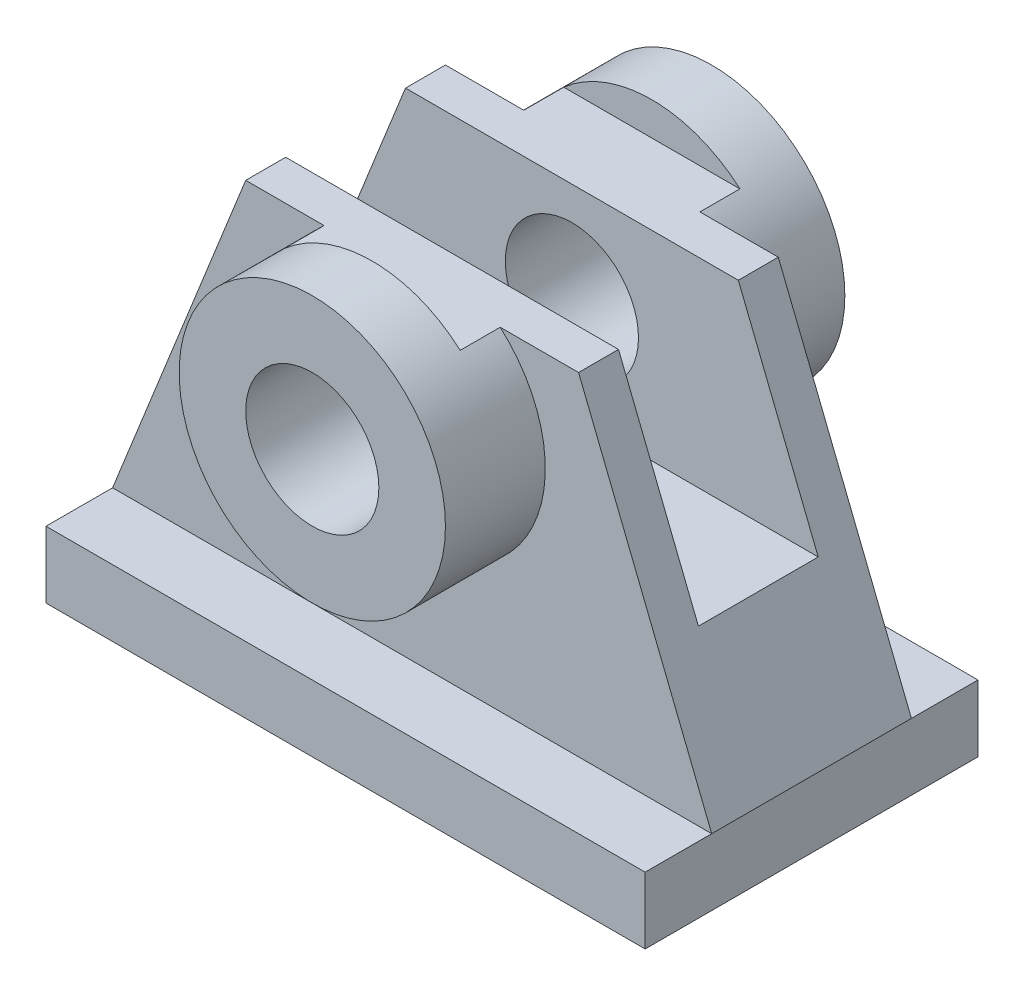
ISO-10303-21;
HEADER;
FILE_DESCRIPTION(('STEP AP214'),'2;1');
FILE_NAME('part.step','',(''),(''),'','','');
FILE_SCHEMA(('AUTOMOTIVE_DESIGN { 1 0 10303 214 1 1 1 1 }'));
ENDSEC;
DATA;
#1=APPLICATION_CONTEXT('core data for automotive mechanical design processes');
#2=APPLICATION_PROTOCOL_DEFINITION('international standard','automotive_design',2000,#1);
#3=PRODUCT_CONTEXT('',#1,'mechanical');
#4=PRODUCT('Part','Part','',(#3));
#5=PRODUCT_RELATED_PRODUCT_CATEGORY('part','',(#4));
#6=PRODUCT_DEFINITION_FORMATION('','',#4);
#7=PRODUCT_DEFINITION_CONTEXT('part definition',#1,'design');
#8=PRODUCT_DEFINITION('design','',#6,#7);
#9=PRODUCT_DEFINITION_SHAPE('','',#8);
#10=(LENGTH_UNIT() NAMED_UNIT(*) SI_UNIT(.MILLI.,.METRE.));
#11=(NAMED_UNIT(*) PLANE_ANGLE_UNIT() SI_UNIT($,.RADIAN.));
#12=(NAMED_UNIT(*) SI_UNIT($,.STERADIAN.) SOLID_ANGLE_UNIT());
#13=UNCERTAINTY_MEASURE_WITH_UNIT(LENGTH_MEASURE(1.E-05),#10,'distance_accuracy_value','');
#14=(GEOMETRIC_REPRESENTATION_CONTEXT(3) GLOBAL_UNCERTAINTY_ASSIGNED_CONTEXT((#13)) GLOBAL_UNIT_ASSIGNED_CONTEXT((#10,
#11,#12)) REPRESENTATION_CONTEXT('',''));
#15=CARTESIAN_POINT('',(0.,0.,0.));
#16=DIRECTION('',(0.,0.,1.));
#17=DIRECTION('',(1.,0.,0.));
#18=AXIS2_PLACEMENT_3D('',#15,#16,#17);
#19=CARTESIAN_POINT('',(0.,0.,25.));
#20=DIRECTION('',(0.,-1.,0.));
#21=DIRECTION('',(0.,0.,-1.));
#22=AXIS2_PLACEMENT_3D('',#19,#20,#21);
#23=PLANE('',#22);
#24=DIRECTION('',(0.,0.,-1.));
#25=VECTOR('',#24,1.);
#26=CARTESIAN_POINT('',(-45.,0.,25.));
#27=LINE('',#26,#25);
#28=CARTESIAN_POINT('',(-45.,0.,-15.));
#29=VERTEX_POINT('',#28);
#30=CARTESIAN_POINT('',(-45.,0.,-25.));
#31=VERTEX_POINT('',#30);
#32=EDGE_CURVE('E219',#29,#31,#27,.T.);
#33=ORIENTED_EDGE('',*,*,#32,.F.);
#34=DIRECTION('',(-1.,0.,0.));
#35=VECTOR('',#34,1.);
#36=CARTESIAN_POINT('',(0.,0.,-15.));
#37=LINE('',#36,#35);
#38=CARTESIAN_POINT('',(45.,0.,-15.));
#39=VERTEX_POINT('',#38);
#40=EDGE_CURVE('E395',#39,#29,#37,.T.);
#41=ORIENTED_EDGE('',*,*,#40,.F.);
#42=DIRECTION('',(0.,0.,-1.));
#43=VECTOR('',#42,1.);
#44=CARTESIAN_POINT('',(45.,0.,25.));
#45=LINE('',#44,#43);
#46=CARTESIAN_POINT('',(45.,0.,-25.));
#47=VERTEX_POINT('',#46);
#48=EDGE_CURVE('E237',#39,#47,#45,.T.);
#49=ORIENTED_EDGE('',*,*,#48,.T.);
#50=DIRECTION('',(-1.,0.,0.));
#51=VECTOR('',#50,1.);
#52=CARTESIAN_POINT('',(0.,0.,-25.));
#53=LINE('',#52,#51);
#54=EDGE_CURVE('E209',#47,#31,#53,.T.);
#55=ORIENTED_EDGE('',*,*,#54,.T.);
#56=EDGE_LOOP('',(#33,#41,#49,#55));
#57=FACE_BOUND('',#56,.T.);
#58=ADVANCED_FACE('F45',(#57),#23,.F.);
#59=CARTESIAN_POINT('',(-45.,0.,25.));
#60=DIRECTION('',(-1.,0.,0.));
#61=DIRECTION('',(0.,0.,1.));
#62=AXIS2_PLACEMENT_3D('',#59,#60,#61);
#63=PLANE('',#62);
#64=DIRECTION('',(0.,1.,0.));
#65=VECTOR('',#64,1.);
#66=CARTESIAN_POINT('',(-45.,0.,-25.));
#67=LINE('',#66,#65);
#68=CARTESIAN_POINT('',(-45.,-10.,-25.));
#69=VERTEX_POINT('',#68);
#70=EDGE_CURVE('E203',#69,#31,#67,.T.);
#71=ORIENTED_EDGE('',*,*,#70,.F.);
#72=DIRECTION('',(0.,0.,-1.));
#73=VECTOR('',#72,1.);
#74=CARTESIAN_POINT('',(-45.,-10.,25.));
#75=LINE('',#74,#73);
#76=CARTESIAN_POINT('',(-45.,-10.,25.));
#77=VERTEX_POINT('',#76);
#78=EDGE_CURVE('E246',#77,#69,#75,.T.);
#79=ORIENTED_EDGE('',*,*,#78,.F.);
#80=DIRECTION('',(0.,1.,0.));
#81=VECTOR('',#80,1.);
#82=CARTESIAN_POINT('',(-45.,0.,25.));
#83=LINE('',#82,#81);
#84=CARTESIAN_POINT('',(-45.,0.,25.));
#85=VERTEX_POINT('',#84);
#86=EDGE_CURVE('E204',#77,#85,#83,.T.);
#87=ORIENTED_EDGE('',*,*,#86,.T.);
#88=CARTESIAN_POINT('',(-45.,0.,15.));
#89=VERTEX_POINT('',#88);
#90=EDGE_CURVE('E234',#85,#89,#27,.T.);
#91=ORIENTED_EDGE('',*,*,#90,.T.);
#92=EDGE_CURVE('E69',#89,#29,#27,.T.);
#93=ORIENTED_EDGE('',*,*,#92,.T.);
#94=ORIENTED_EDGE('',*,*,#32,.T.);
#95=EDGE_LOOP('',(#71,#79,#87,#91,#93,#94));
#96=FACE_BOUND('',#95,.T.);
#97=ADVANCED_FACE('F47',(#96),#63,.T.);
#98=CARTESIAN_POINT('',(0.,-10.,25.));
#99=DIRECTION('',(0.,-1.,0.));
#100=DIRECTION('',(0.,0.,-1.));
#101=AXIS2_PLACEMENT_3D('',#98,#99,#100);
#102=PLANE('',#101);
#103=DIRECTION('',(-1.,0.,0.));
#104=VECTOR('',#103,1.);
#105=CARTESIAN_POINT('',(0.,-10.,-25.));
#106=LINE('',#105,#104);
#107=CARTESIAN_POINT('',(45.,-10.,-25.));
#108=VERTEX_POINT('',#107);
#109=EDGE_CURVE('E223',#108,#69,#106,.T.);
#110=ORIENTED_EDGE('',*,*,#109,.F.);
#111=DIRECTION('',(0.,0.,-1.));
#112=VECTOR('',#111,1.);
#113=CARTESIAN_POINT('',(45.,-10.,25.));
#114=LINE('',#113,#112);
#115=CARTESIAN_POINT('',(45.,-10.,25.));
#116=VERTEX_POINT('',#115);
#117=EDGE_CURVE('E242',#116,#108,#114,.T.);
#118=ORIENTED_EDGE('',*,*,#117,.F.);
#119=DIRECTION('',(-1.,0.,0.));
#120=VECTOR('',#119,1.);
#121=CARTESIAN_POINT('',(0.,-10.,25.));
#122=LINE('',#121,#120);
#123=EDGE_CURVE('E208',#116,#77,#122,.T.);
#124=ORIENTED_EDGE('',*,*,#123,.T.);
#125=ORIENTED_EDGE('',*,*,#78,.T.);
#126=EDGE_LOOP('',(#110,#118,#124,#125));
#127=FACE_BOUND('',#126,.T.);
#128=ADVANCED_FACE('F339',(#127),#102,.T.);
#129=CARTESIAN_POINT('',(45.,0.,25.));
#130=DIRECTION('',(-1.,0.,0.));
#131=DIRECTION('',(0.,0.,1.));
#132=AXIS2_PLACEMENT_3D('',#129,#130,#131);
#133=PLANE('',#132);
#134=DIRECTION('',(0.,1.,0.));
#135=VECTOR('',#134,1.);
#136=CARTESIAN_POINT('',(45.,0.,-25.));
#137=LINE('',#136,#135);
#138=EDGE_CURVE('E227',#108,#47,#137,.T.);
#139=ORIENTED_EDGE('',*,*,#138,.T.);
#140=ORIENTED_EDGE('',*,*,#48,.F.);
#141=CARTESIAN_POINT('',(45.,0.,15.));
#142=VERTEX_POINT('',#141);
#143=EDGE_CURVE('E243',#142,#39,#45,.T.);
#144=ORIENTED_EDGE('',*,*,#143,.F.);
#145=CARTESIAN_POINT('',(45.,0.,25.));
#146=VERTEX_POINT('',#145);
#147=EDGE_CURVE('E238',#146,#142,#45,.T.);
#148=ORIENTED_EDGE('',*,*,#147,.F.);
#149=DIRECTION('',(0.,1.,0.));
#150=VECTOR('',#149,1.);
#151=CARTESIAN_POINT('',(45.,0.,25.));
#152=LINE('',#151,#150);
#153=EDGE_CURVE('E213',#116,#146,#152,.T.);
#154=ORIENTED_EDGE('',*,*,#153,.F.);
#155=ORIENTED_EDGE('',*,*,#117,.T.);
#156=EDGE_LOOP('',(#139,#140,#144,#148,#154,#155));
#157=FACE_BOUND('',#156,.T.);
#158=ADVANCED_FACE('F343',(#157),#133,.F.);
#159=ORIENTED_EDGE('',*,*,#147,.T.);
#160=DIRECTION('',(-1.,0.,0.));
#161=VECTOR('',#160,1.);
#162=CARTESIAN_POINT('',(0.,0.,15.));
#163=LINE('',#162,#161);
#164=EDGE_CURVE('E200',#142,#89,#163,.T.);
#165=ORIENTED_EDGE('',*,*,#164,.T.);
#166=ORIENTED_EDGE('',*,*,#90,.F.);
#167=DIRECTION('',(-1.,0.,0.));
#168=VECTOR('',#167,1.);
#169=CARTESIAN_POINT('',(0.,0.,25.));
#170=LINE('',#169,#168);
#171=EDGE_CURVE('E216',#146,#85,#170,.T.);
#172=ORIENTED_EDGE('',*,*,#171,.F.);
#173=EDGE_LOOP('',(#159,#165,#166,#172));
#174=FACE_BOUND('',#173,.T.);
#175=ADVANCED_FACE('F326',(#174),#23,.F.);
#176=CARTESIAN_POINT('',(0.,0.,25.));
#177=DIRECTION('',(0.,0.,1.));
#178=DIRECTION('',(1.,0.,0.));
#179=AXIS2_PLACEMENT_3D('',#176,#177,#178);
#180=PLANE('',#179);
#181=ORIENTED_EDGE('',*,*,#86,.F.);
#182=ORIENTED_EDGE('',*,*,#123,.F.);
#183=ORIENTED_EDGE('',*,*,#153,.T.);
#184=ORIENTED_EDGE('',*,*,#171,.T.);
#185=EDGE_LOOP('',(#181,#182,#183,#184));
#186=FACE_BOUND('',#185,.T.);
#187=ADVANCED_FACE('F336',(#186),#180,.T.);
#188=CARTESIAN_POINT('',(0.,0.,-25.));
#189=DIRECTION('',(0.,0.,1.));
#190=DIRECTION('',(1.,0.,0.));
#191=AXIS2_PLACEMENT_3D('',#188,#189,#190);
#192=PLANE('',#191);
#193=ORIENTED_EDGE('',*,*,#70,.T.);
#194=ORIENTED_EDGE('',*,*,#54,.F.);
#195=ORIENTED_EDGE('',*,*,#138,.F.);
#196=ORIENTED_EDGE('',*,*,#109,.T.);
#197=EDGE_LOOP('',(#193,#194,#195,#196));
#198=FACE_BOUND('',#197,.T.);
#199=ADVANCED_FACE('F431',(#198),#192,.F.);
#200=CARTESIAN_POINT('',(38.7931034482759,15.5172413793104,15.));
#201=DIRECTION('',(0.928476690885259,0.371390676354104,0.));
#202=DIRECTION('',(-0.371390676354104,0.928476690885259,0.));
#203=AXIS2_PLACEMENT_3D('',#200,#201,#202);
#204=PLANE('',#203);
#205=DIRECTION('',(0.371390676354104,-0.928476690885259,0.));
#206=VECTOR('',#205,1.);
#207=CARTESIAN_POINT('',(38.7931034482759,15.5172413793104,9.));
#208=LINE('',#207,#206);
#209=CARTESIAN_POINT('',(25.,50.,9.));
#210=VERTEX_POINT('',#209);
#211=CARTESIAN_POINT('',(37.,20.,8.99999999999999));
#212=VERTEX_POINT('',#211);
#213=EDGE_CURVE('E177',#210,#212,#208,.T.);
#214=ORIENTED_EDGE('',*,*,#213,.F.);
#215=DIRECTION('',(0.,0.,-1.));
#216=VECTOR('',#215,1.);
#217=CARTESIAN_POINT('',(25.,50.,15.));
#218=LINE('',#217,#216);
#219=CARTESIAN_POINT('',(25.,50.,15.));
#220=VERTEX_POINT('',#219);
#221=EDGE_CURVE('E199',#220,#210,#218,.T.);
#222=ORIENTED_EDGE('',*,*,#221,.F.);
#223=DIRECTION('',(0.371390676354104,-0.928476690885259,0.));
#224=VECTOR('',#223,1.);
#225=CARTESIAN_POINT('',(38.7931034482759,15.5172413793104,15.));
#226=LINE('',#225,#224);
#227=EDGE_CURVE('E186',#220,#142,#226,.T.);
#228=ORIENTED_EDGE('',*,*,#227,.T.);
#229=ORIENTED_EDGE('',*,*,#143,.T.);
#230=DIRECTION('',(0.371390676354104,-0.928476690885259,0.));
#231=VECTOR('',#230,1.);
#232=CARTESIAN_POINT('',(38.7931034482759,15.5172413793104,-15.));
#233=LINE('',#232,#231);
#234=CARTESIAN_POINT('',(25.,50.,-15.));
#235=VERTEX_POINT('',#234);
#236=EDGE_CURVE('E309',#235,#39,#233,.T.);
#237=ORIENTED_EDGE('',*,*,#236,.F.);
#238=DIRECTION('',(0.,0.,1.));
#239=VECTOR('',#238,1.);
#240=CARTESIAN_POINT('',(25.,50.,-15.));
#241=LINE('',#240,#239);
#242=CARTESIAN_POINT('',(25.,50.,-9.));
#243=VERTEX_POINT('',#242);
#244=EDGE_CURVE('E289',#235,#243,#241,.T.);
#245=ORIENTED_EDGE('',*,*,#244,.T.);
#246=DIRECTION('',(0.371390676354104,-0.928476690885259,0.));
#247=VECTOR('',#246,1.);
#248=CARTESIAN_POINT('',(38.7931034482759,15.5172413793104,-9.));
#249=LINE('',#248,#247);
#250=CARTESIAN_POINT('',(37.,20.,-9.));
#251=VERTEX_POINT('',#250);
#252=EDGE_CURVE('E299',#243,#251,#249,.T.);
#253=ORIENTED_EDGE('',*,*,#252,.T.);
#254=DIRECTION('',(0.,0.,-1.));
#255=VECTOR('',#254,1.);
#256=CARTESIAN_POINT('',(37.,20.,101.195444572929));
#257=LINE('',#256,#255);
#258=EDGE_CURVE('E179',#212,#251,#257,.T.);
#259=ORIENTED_EDGE('',*,*,#258,.F.);
#260=EDGE_LOOP('',(#214,#222,#228,#229,#237,#245,#253,#259));
#261=FACE_BOUND('',#260,.T.);
#262=ADVANCED_FACE('F350',(#261),#204,.T.);
#263=CARTESIAN_POINT('',(0.,50.,15.));
#264=DIRECTION('',(0.,1.,0.));
#265=DIRECTION('',(-1.,0.,0.));
#266=AXIS2_PLACEMENT_3D('',#263,#264,#265);
#267=PLANE('',#266);
#268=DIRECTION('',(1.,0.,0.));
#269=VECTOR('',#268,1.);
#270=CARTESIAN_POINT('',(0.,50.,9.));
#271=LINE('',#270,#269);
#272=CARTESIAN_POINT('',(-25.,50.,9.));
#273=VERTEX_POINT('',#272);
#274=EDGE_CURVE('E187',#273,#210,#271,.T.);
#275=ORIENTED_EDGE('',*,*,#274,.F.);
#276=DIRECTION('',(0.,0.,-1.));
#277=VECTOR('',#276,1.);
#278=CARTESIAN_POINT('',(-25.,50.,15.));
#279=LINE('',#278,#277);
#280=CARTESIAN_POINT('',(-25.,50.,15.));
#281=VERTEX_POINT('',#280);
#282=EDGE_CURVE('E183',#281,#273,#279,.T.);
#283=ORIENTED_EDGE('',*,*,#282,.F.);
#284=DIRECTION('',(1.,0.,0.));
#285=VECTOR('',#284,1.);
#286=CARTESIAN_POINT('',(0.,50.,15.));
#287=LINE('',#286,#285);
#288=CARTESIAN_POINT('',(-13.228756555323,50.,15.));
#289=VERTEX_POINT('',#288);
#290=EDGE_CURVE('E313',#281,#289,#287,.T.);
#291=ORIENTED_EDGE('',*,*,#290,.T.);
#292=DIRECTION('',(0.,0.,-1.));
#293=VECTOR('',#292,1.);
#294=CARTESIAN_POINT('',(-13.228756555323,50.,30.));
#295=LINE('',#294,#293);
#296=CARTESIAN_POINT('',(-13.228756555323,50.,21.));
#297=VERTEX_POINT('',#296);
#298=EDGE_CURVE('E364',#297,#289,#295,.T.);
#299=ORIENTED_EDGE('',*,*,#298,.F.);
#300=DIRECTION('',(-1.,0.,0.));
#301=VECTOR('',#300,1.);
#302=CARTESIAN_POINT('',(45.,50.,21.));
#303=LINE('',#302,#301);
#304=CARTESIAN_POINT('',(13.228756555323,50.,21.));
#305=VERTEX_POINT('',#304);
#306=EDGE_CURVE('E274',#305,#297,#303,.T.);
#307=ORIENTED_EDGE('',*,*,#306,.F.);
#308=DIRECTION('',(0.,0.,-1.));
#309=VECTOR('',#308,1.);
#310=CARTESIAN_POINT('',(13.228756555323,50.,30.));
#311=LINE('',#310,#309);
#312=CARTESIAN_POINT('',(13.228756555323,50.,15.));
#313=VERTEX_POINT('',#312);
#314=EDGE_CURVE('E360',#313,#305,#311,.F.);
#315=ORIENTED_EDGE('',*,*,#314,.F.);
#316=EDGE_CURVE('E192',#313,#220,#287,.T.);
#317=ORIENTED_EDGE('',*,*,#316,.T.);
#318=ORIENTED_EDGE('',*,*,#221,.T.);
#319=EDGE_LOOP('',(#275,#283,#291,#299,#307,#315,#317,#318));
#320=FACE_BOUND('',#319,.T.);
#321=ADVANCED_FACE('F357',(#320),#267,.T.);
#322=CARTESIAN_POINT('',(-38.7931034482759,15.5172413793103,15.));
#323=DIRECTION('',(-0.928476690885259,0.371390676354103,0.));
#324=DIRECTION('',(-0.371390676354103,-0.92847669088526,0.));
#325=AXIS2_PLACEMENT_3D('',#322,#323,#324);
#326=PLANE('',#325);
#327=DIRECTION('',(0.371390676354103,0.92847669088526,0.));
#328=VECTOR('',#327,1.);
#329=CARTESIAN_POINT('',(-38.7931034482759,15.5172413793103,9.));
#330=LINE('',#329,#328);
#331=CARTESIAN_POINT('',(-37.,20.,8.99999999999999));
#332=VERTEX_POINT('',#331);
#333=EDGE_CURVE('E174',#332,#273,#330,.T.);
#334=ORIENTED_EDGE('',*,*,#333,.F.);
#335=DIRECTION('',(0.,0.,-1.));
#336=VECTOR('',#335,1.);
#337=CARTESIAN_POINT('',(-37.,20.,101.195444572929));
#338=LINE('',#337,#336);
#339=CARTESIAN_POINT('',(-37.,20.,-9.));
#340=VERTEX_POINT('',#339);
#341=EDGE_CURVE('E159',#332,#340,#338,.T.);
#342=ORIENTED_EDGE('',*,*,#341,.T.);
#343=DIRECTION('',(0.371390676354103,0.92847669088526,0.));
#344=VECTOR('',#343,1.);
#345=CARTESIAN_POINT('',(-38.7931034482759,15.5172413793103,-9.));
#346=LINE('',#345,#344);
#347=CARTESIAN_POINT('',(-25.,50.,-9.));
#348=VERTEX_POINT('',#347);
#349=EDGE_CURVE('E303',#340,#348,#346,.T.);
#350=ORIENTED_EDGE('',*,*,#349,.T.);
#351=DIRECTION('',(0.,0.,1.));
#352=VECTOR('',#351,1.);
#353=CARTESIAN_POINT('',(-25.,50.,-15.));
#354=LINE('',#353,#352);
#355=CARTESIAN_POINT('',(-25.,50.,-15.));
#356=VERTEX_POINT('',#355);
#357=EDGE_CURVE('E294',#356,#348,#354,.T.);
#358=ORIENTED_EDGE('',*,*,#357,.F.);
#359=DIRECTION('',(0.371390676354103,0.92847669088526,0.));
#360=VECTOR('',#359,1.);
#361=CARTESIAN_POINT('',(-38.7931034482759,15.5172413793103,-15.));
#362=LINE('',#361,#360);
#363=EDGE_CURVE('E286',#29,#356,#362,.T.);
#364=ORIENTED_EDGE('',*,*,#363,.F.);
#365=ORIENTED_EDGE('',*,*,#92,.F.);
#366=DIRECTION('',(0.371390676354103,0.92847669088526,0.));
#367=VECTOR('',#366,1.);
#368=CARTESIAN_POINT('',(-38.7931034482759,15.5172413793103,15.));
#369=LINE('',#368,#367);
#370=EDGE_CURVE('E317',#89,#281,#369,.T.);
#371=ORIENTED_EDGE('',*,*,#370,.T.);
#372=ORIENTED_EDGE('',*,*,#282,.T.);
#373=EDGE_LOOP('',(#334,#342,#350,#358,#364,#365,#371,#372));
#374=FACE_BOUND('',#373,.T.);
#375=ADVANCED_FACE('F181',(#374),#326,.T.);
#376=CARTESIAN_POINT('',(0.,0.,15.));
#377=DIRECTION('',(0.,0.,1.));
#378=DIRECTION('',(1.,0.,0.));
#379=AXIS2_PLACEMENT_3D('',#376,#377,#378);
#380=PLANE('',#379);
#381=ORIENTED_EDGE('',*,*,#316,.F.);
#382=CARTESIAN_POINT('',(0.,35.,15.));
#383=DIRECTION('',(0.,0.,1.));
#384=DIRECTION('',(1.,0.,0.));
#385=AXIS2_PLACEMENT_3D('',#382,#383,#384);
#386=CIRCLE('',#385,20.);
#387=EDGE_CURVE('E249',#313,#289,#386,.F.);
#388=ORIENTED_EDGE('',*,*,#387,.T.);
#389=ORIENTED_EDGE('',*,*,#290,.F.);
#390=ORIENTED_EDGE('',*,*,#370,.F.);
#391=ORIENTED_EDGE('',*,*,#164,.F.);
#392=ORIENTED_EDGE('',*,*,#227,.F.);
#393=EDGE_LOOP('',(#381,#388,#389,#390,#391,#392));
#394=FACE_BOUND('',#393,.T.);
#395=ADVANCED_FACE('F352',(#394),#380,.T.);
#396=CARTESIAN_POINT('',(0.,0.,9.));
#397=DIRECTION('',(0.,0.,1.));
#398=DIRECTION('',(1.,0.,0.));
#399=AXIS2_PLACEMENT_3D('',#396,#397,#398);
#400=PLANE('',#399);
#401=CARTESIAN_POINT('',(0.,35.,9.));
#402=DIRECTION('',(0.,0.,1.));
#403=DIRECTION('',(1.,0.,0.));
#404=AXIS2_PLACEMENT_3D('',#401,#402,#403);
#405=CIRCLE('',#404,10.);
#406=CARTESIAN_POINT('',(10.,35.,9.));
#407=VERTEX_POINT('',#406);
#408=EDGE_CURVE('E372',#407,#407,#405,.T.);
#409=ORIENTED_EDGE('',*,*,#408,.T.);
#410=EDGE_LOOP('',(#409));
#411=FACE_BOUND('',#410,.T.);
#412=ORIENTED_EDGE('',*,*,#213,.T.);
#413=DIRECTION('',(1.,0.,0.));
#414=VECTOR('',#413,1.);
#415=CARTESIAN_POINT('',(37.,20.,8.99999999999999));
#416=LINE('',#415,#414);
#417=EDGE_CURVE('E162',#332,#212,#416,.T.);
#418=ORIENTED_EDGE('',*,*,#417,.F.);
#419=ORIENTED_EDGE('',*,*,#333,.T.);
#420=ORIENTED_EDGE('',*,*,#274,.T.);
#421=EDGE_LOOP('',(#412,#418,#419,#420));
#422=FACE_BOUND('',#421,.T.);
#423=ADVANCED_FACE('F172',(#411,#422),#400,.F.);
#424=CARTESIAN_POINT('',(0.,50.,-15.));
#425=DIRECTION('',(0.,-1.,0.));
#426=DIRECTION('',(1.,0.,0.));
#427=AXIS2_PLACEMENT_3D('',#424,#425,#426);
#428=PLANE('',#427);
#429=DIRECTION('',(1.,0.,0.));
#430=VECTOR('',#429,1.);
#431=CARTESIAN_POINT('',(0.,50.,-9.));
#432=LINE('',#431,#430);
#433=EDGE_CURVE('E307',#348,#243,#432,.T.);
#434=ORIENTED_EDGE('',*,*,#433,.T.);
#435=ORIENTED_EDGE('',*,*,#244,.F.);
#436=DIRECTION('',(1.,0.,0.));
#437=VECTOR('',#436,1.);
#438=CARTESIAN_POINT('',(0.,50.,-15.));
#439=LINE('',#438,#437);
#440=CARTESIAN_POINT('',(13.228756555323,50.,-15.));
#441=VERTEX_POINT('',#440);
#442=EDGE_CURVE('E266',#441,#235,#439,.T.);
#443=ORIENTED_EDGE('',*,*,#442,.F.);
#444=DIRECTION('',(0.,0.,1.));
#445=VECTOR('',#444,1.);
#446=CARTESIAN_POINT('',(13.228756555323,50.,-30.));
#447=LINE('',#446,#445);
#448=CARTESIAN_POINT('',(13.228756555323,50.,-21.));
#449=VERTEX_POINT('',#448);
#450=EDGE_CURVE('E54',#441,#449,#447,.F.);
#451=ORIENTED_EDGE('',*,*,#450,.T.);
#452=DIRECTION('',(-1.,0.,0.));
#453=VECTOR('',#452,1.);
#454=CARTESIAN_POINT('',(45.,50.,-21.));
#455=LINE('',#454,#453);
#456=CARTESIAN_POINT('',(-13.228756555323,50.,-21.));
#457=VERTEX_POINT('',#456);
#458=EDGE_CURVE('E61',#449,#457,#455,.T.);
#459=ORIENTED_EDGE('',*,*,#458,.T.);
#460=DIRECTION('',(0.,0.,1.));
#461=VECTOR('',#460,1.);
#462=CARTESIAN_POINT('',(-13.228756555323,50.,-30.));
#463=LINE('',#462,#461);
#464=CARTESIAN_POINT('',(-13.228756555323,50.,-15.));
#465=VERTEX_POINT('',#464);
#466=EDGE_CURVE('E257',#457,#465,#463,.T.);
#467=ORIENTED_EDGE('',*,*,#466,.T.);
#468=EDGE_CURVE('E281',#356,#465,#439,.T.);
#469=ORIENTED_EDGE('',*,*,#468,.F.);
#470=ORIENTED_EDGE('',*,*,#357,.T.);
#471=EDGE_LOOP('',(#434,#435,#443,#451,#459,#467,#469,#470));
#472=FACE_BOUND('',#471,.T.);
#473=ADVANCED_FACE('F264',(#472),#428,.F.);
#474=CARTESIAN_POINT('',(0.,0.,-15.));
#475=DIRECTION('',(0.,0.,-1.));
#476=DIRECTION('',(1.,0.,0.));
#477=AXIS2_PLACEMENT_3D('',#474,#475,#476);
#478=PLANE('',#477);
#479=CARTESIAN_POINT('',(0.,35.,-15.));
#480=DIRECTION('',(0.,0.,-1.));
#481=DIRECTION('',(-1.,0.,0.));
#482=AXIS2_PLACEMENT_3D('',#479,#480,#481);
#483=CIRCLE('',#482,20.);
#484=EDGE_CURVE('E253',#441,#465,#483,.T.);
#485=ORIENTED_EDGE('',*,*,#484,.F.);
#486=ORIENTED_EDGE('',*,*,#442,.T.);
#487=ORIENTED_EDGE('',*,*,#236,.T.);
#488=ORIENTED_EDGE('',*,*,#40,.T.);
#489=ORIENTED_EDGE('',*,*,#363,.T.);
#490=ORIENTED_EDGE('',*,*,#468,.T.);
#491=EDGE_LOOP('',(#485,#486,#487,#488,#489,#490));
#492=FACE_BOUND('',#491,.T.);
#493=ADVANCED_FACE('F283',(#492),#478,.T.);
#494=CARTESIAN_POINT('',(0.,0.,-9.));
#495=DIRECTION('',(0.,0.,-1.));
#496=DIRECTION('',(1.,0.,0.));
#497=AXIS2_PLACEMENT_3D('',#494,#495,#496);
#498=PLANE('',#497);
#499=CARTESIAN_POINT('',(0.,35.,-9.));
#500=DIRECTION('',(0.,0.,-1.));
#501=DIRECTION('',(-1.,0.,0.));
#502=AXIS2_PLACEMENT_3D('',#499,#500,#501);
#503=CIRCLE('',#502,10.);
#504=CARTESIAN_POINT('',(-10.,35.,-9.));
#505=VERTEX_POINT('',#504);
#506=EDGE_CURVE('E368',#505,#505,#503,.T.);
#507=ORIENTED_EDGE('',*,*,#506,.T.);
#508=EDGE_LOOP('',(#507));
#509=FACE_BOUND('',#508,.T.);
#510=ORIENTED_EDGE('',*,*,#349,.F.);
#511=DIRECTION('',(1.,0.,0.));
#512=VECTOR('',#511,1.);
#513=CARTESIAN_POINT('',(37.,20.,-9.));
#514=LINE('',#513,#512);
#515=EDGE_CURVE('E165',#340,#251,#514,.T.);
#516=ORIENTED_EDGE('',*,*,#515,.T.);
#517=ORIENTED_EDGE('',*,*,#252,.F.);
#518=ORIENTED_EDGE('',*,*,#433,.F.);
#519=EDGE_LOOP('',(#510,#516,#517,#518));
#520=FACE_BOUND('',#519,.T.);
#521=ADVANCED_FACE('F402',(#509,#520),#498,.F.);
#522=CARTESIAN_POINT('',(0.,35.,30.));
#523=DIRECTION('',(0.,0.,-1.));
#524=DIRECTION('',(-1.,0.,0.));
#525=AXIS2_PLACEMENT_3D('',#522,#523,#524);
#526=CYLINDRICAL_SURFACE('',#525,10.);
#527=CARTESIAN_POINT('',(0.,35.,30.));
#528=DIRECTION('',(0.,0.,1.));
#529=DIRECTION('',(1.,0.,0.));
#530=AXIS2_PLACEMENT_3D('',#527,#528,#529);
#531=CIRCLE('',#530,10.);
#532=CARTESIAN_POINT('',(10.,35.,30.));
#533=VERTEX_POINT('',#532);
#534=EDGE_CURVE('E386',#533,#533,#531,.T.);
#535=ORIENTED_EDGE('',*,*,#534,.T.);
#536=EDGE_LOOP('',(#535));
#537=FACE_BOUND('',#536,.T.);
#538=ORIENTED_EDGE('',*,*,#408,.F.);
#539=EDGE_LOOP('',(#538));
#540=FACE_BOUND('',#539,.T.);
#541=ADVANCED_FACE('F496',(#537,#540),#526,.F.);
#542=CARTESIAN_POINT('',(0.,35.,30.));
#543=DIRECTION('',(0.,0.,-1.));
#544=DIRECTION('',(-1.,0.,0.));
#545=AXIS2_PLACEMENT_3D('',#542,#543,#544);
#546=CYLINDRICAL_SURFACE('',#545,20.);
#547=CARTESIAN_POINT('',(0.,35.,30.));
#548=DIRECTION('',(0.,0.,1.));
#549=DIRECTION('',(1.,0.,0.));
#550=AXIS2_PLACEMENT_3D('',#547,#548,#549);
#551=CIRCLE('',#550,20.);
#552=CARTESIAN_POINT('',(20.,35.,30.));
#553=VERTEX_POINT('',#552);
#554=EDGE_CURVE('E304',#553,#553,#551,.T.);
#555=ORIENTED_EDGE('',*,*,#554,.F.);
#556=EDGE_LOOP('',(#555));
#557=FACE_BOUND('',#556,.T.);
#558=CARTESIAN_POINT('',(0.,35.,21.));
#559=DIRECTION('',(0.,0.,1.));
#560=DIRECTION('',(1.,0.,0.));
#561=AXIS2_PLACEMENT_3D('',#558,#559,#560);
#562=CIRCLE('',#561,20.);
#563=EDGE_CURVE('E11',#305,#297,#562,.T.);
#564=ORIENTED_EDGE('',*,*,#563,.T.);
#565=ORIENTED_EDGE('',*,*,#298,.T.);
#566=ORIENTED_EDGE('',*,*,#387,.F.);
#567=ORIENTED_EDGE('',*,*,#314,.T.);
#568=EDGE_LOOP('',(#564,#565,#566,#567));
#569=FACE_BOUND('',#568,.T.);
#570=ADVANCED_FACE('F366',(#557,#569),#546,.T.);
#571=CARTESIAN_POINT('',(0.,0.,30.));
#572=DIRECTION('',(0.,0.,1.));
#573=DIRECTION('',(1.,0.,0.));
#574=AXIS2_PLACEMENT_3D('',#571,#572,#573);
#575=PLANE('',#574);
#576=ORIENTED_EDGE('',*,*,#534,.F.);
#577=EDGE_LOOP('',(#576));
#578=FACE_BOUND('',#577,.T.);
#579=ORIENTED_EDGE('',*,*,#554,.T.);
#580=EDGE_LOOP('',(#579));
#581=FACE_BOUND('',#580,.T.);
#582=ADVANCED_FACE('F545',(#578,#581),#575,.T.);
#583=CARTESIAN_POINT('',(0.,35.,-30.));
#584=DIRECTION('',(0.,0.,1.));
#585=DIRECTION('',(1.,0.,0.));
#586=AXIS2_PLACEMENT_3D('',#583,#584,#585);
#587=CYLINDRICAL_SURFACE('',#586,10.);
#588=CARTESIAN_POINT('',(0.,35.,-30.));
#589=DIRECTION('',(0.,0.,1.));
#590=DIRECTION('',(1.,0.,0.));
#591=AXIS2_PLACEMENT_3D('',#588,#589,#590);
#592=CIRCLE('',#591,10.);
#593=CARTESIAN_POINT('',(10.,35.,-30.));
#594=VERTEX_POINT('',#593);
#595=EDGE_CURVE('E378',#594,#594,#592,.T.);
#596=ORIENTED_EDGE('',*,*,#595,.F.);
#597=EDGE_LOOP('',(#596));
#598=FACE_BOUND('',#597,.T.);
#599=ORIENTED_EDGE('',*,*,#506,.F.);
#600=EDGE_LOOP('',(#599));
#601=FACE_BOUND('',#600,.T.);
#602=ADVANCED_FACE('F536',(#598,#601),#587,.F.);
#603=CARTESIAN_POINT('',(0.,35.,-30.));
#604=DIRECTION('',(0.,0.,1.));
#605=DIRECTION('',(1.,0.,0.));
#606=AXIS2_PLACEMENT_3D('',#603,#604,#605);
#607=CYLINDRICAL_SURFACE('',#606,20.);
#608=ORIENTED_EDGE('',*,*,#450,.F.);
#609=ORIENTED_EDGE('',*,*,#484,.T.);
#610=ORIENTED_EDGE('',*,*,#466,.F.);
#611=CARTESIAN_POINT('',(0.,35.,-21.));
#612=DIRECTION('',(0.,0.,-1.));
#613=DIRECTION('',(-1.,0.,0.));
#614=AXIS2_PLACEMENT_3D('',#611,#612,#613);
#615=CIRCLE('',#614,20.);
#616=EDGE_CURVE('E260',#449,#457,#615,.F.);
#617=ORIENTED_EDGE('',*,*,#616,.F.);
#618=EDGE_LOOP('',(#608,#609,#610,#617));
#619=FACE_BOUND('',#618,.T.);
#620=CARTESIAN_POINT('',(0.,35.,-30.));
#621=DIRECTION('',(0.,0.,1.));
#622=DIRECTION('',(1.,0.,0.));
#623=AXIS2_PLACEMENT_3D('',#620,#621,#622);
#624=CIRCLE('',#623,20.);
#625=CARTESIAN_POINT('',(20.,35.,-30.));
#626=VERTEX_POINT('',#625);
#627=EDGE_CURVE('E382',#626,#626,#624,.T.);
#628=ORIENTED_EDGE('',*,*,#627,.T.);
#629=EDGE_LOOP('',(#628));
#630=FACE_BOUND('',#629,.T.);
#631=ADVANCED_FACE('F276',(#619,#630),#607,.T.);
#632=CARTESIAN_POINT('',(0.,0.,-30.));
#633=DIRECTION('',(0.,0.,-1.));
#634=DIRECTION('',(1.,0.,0.));
#635=AXIS2_PLACEMENT_3D('',#632,#633,#634);
#636=PLANE('',#635);
#637=ORIENTED_EDGE('',*,*,#595,.T.);
#638=EDGE_LOOP('',(#637));
#639=FACE_BOUND('',#638,.T.);
#640=ORIENTED_EDGE('',*,*,#627,.F.);
#641=EDGE_LOOP('',(#640));
#642=FACE_BOUND('',#641,.T.);
#643=ADVANCED_FACE('F417',(#639,#642),#636,.T.);
#644=CARTESIAN_POINT('',(45.,50.,-21.));
#645=DIRECTION('',(0.,0.,-1.));
#646=DIRECTION('',(-1.,0.,0.));
#647=AXIS2_PLACEMENT_3D('',#644,#645,#646);
#648=PLANE('',#647);
#649=ORIENTED_EDGE('',*,*,#616,.T.);
#650=ORIENTED_EDGE('',*,*,#458,.F.);
#651=EDGE_LOOP('',(#649,#650));
#652=FACE_BOUND('',#651,.T.);
#653=ADVANCED_FACE('F271',(#652),#648,.F.);
#654=CARTESIAN_POINT('',(45.,65.,21.));
#655=DIRECTION('',(0.,0.,1.));
#656=DIRECTION('',(1.,0.,0.));
#657=AXIS2_PLACEMENT_3D('',#654,#655,#656);
#658=PLANE('',#657);
#659=ORIENTED_EDGE('',*,*,#306,.T.);
#660=ORIENTED_EDGE('',*,*,#563,.F.);
#661=EDGE_LOOP('',(#659,#660));
#662=FACE_BOUND('',#661,.T.);
#663=ADVANCED_FACE('F409',(#662),#658,.F.);
#664=CARTESIAN_POINT('',(37.,20.,101.195444572929));
#665=DIRECTION('',(0.,1.,0.));
#666=DIRECTION('',(0.,0.,1.));
#667=AXIS2_PLACEMENT_3D('',#664,#665,#666);
#668=PLANE('',#667);
#669=ORIENTED_EDGE('',*,*,#341,.F.);
#670=ORIENTED_EDGE('',*,*,#417,.T.);
#671=ORIENTED_EDGE('',*,*,#258,.T.);
#672=ORIENTED_EDGE('',*,*,#515,.F.);
#673=EDGE_LOOP('',(#669,#670,#671,#672));
#674=FACE_BOUND('',#673,.T.);
#675=ADVANCED_FACE('F161',(#674),#668,.T.);
#676=CLOSED_SHELL('',(#58,#97,#128,#158,#175,#187,#199,#262,#321,#375,#395,#423,#473,#493,#521,
#541,#570,#582,#602,#631,#643,#653,#663,#675));
#677=MANIFOLD_SOLID_BREP('B2',#676);
#678=ADVANCED_BREP_SHAPE_REPRESENTATION('',(#18,#677),#14);
#679=SHAPE_DEFINITION_REPRESENTATION(#9,#678);
ENDSEC;
END-ISO-10303-21;
